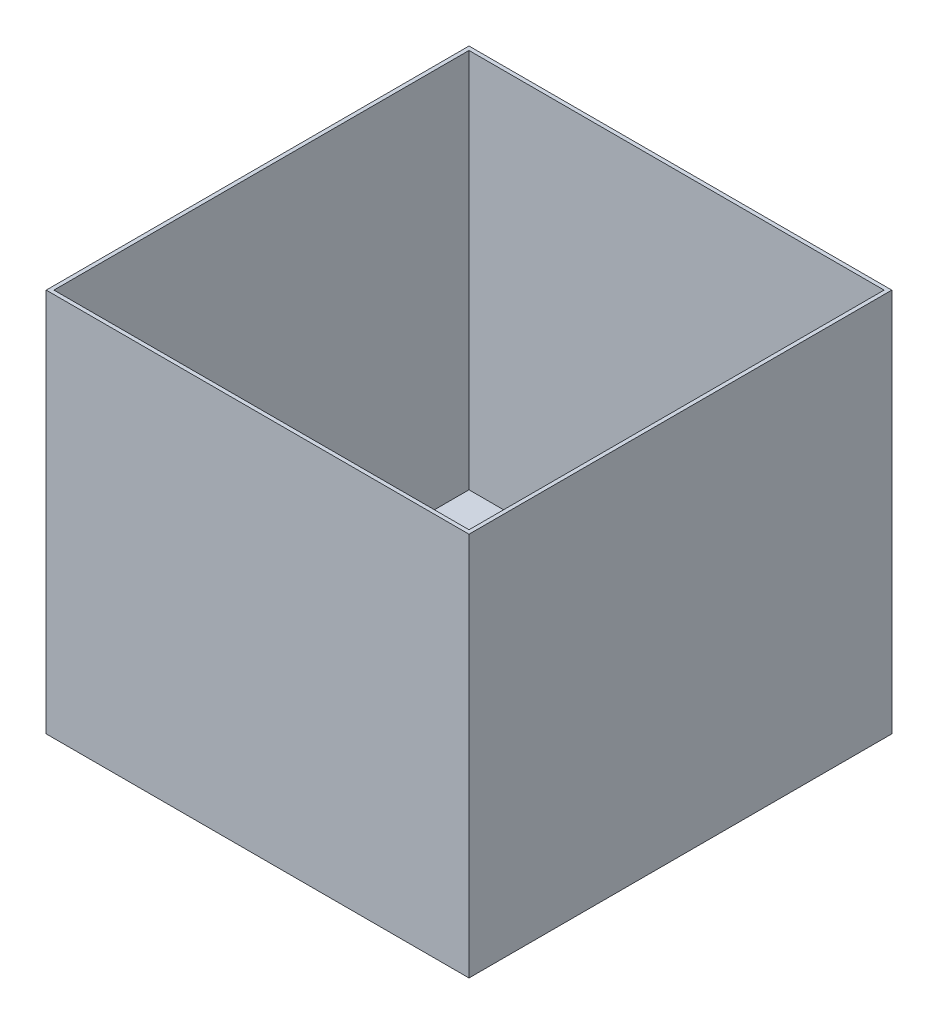
ISO-10303-21;
HEADER;
FILE_DESCRIPTION(('STEP AP214'),'2;1');
FILE_NAME('part.step','',(''),(''),'','','');
FILE_SCHEMA(('AUTOMOTIVE_DESIGN { 1 0 10303 214 1 1 1 1 }'));
ENDSEC;
DATA;
#1=APPLICATION_CONTEXT('core data for automotive mechanical design processes');
#2=APPLICATION_PROTOCOL_DEFINITION('international standard','automotive_design',2000,#1);
#3=PRODUCT_CONTEXT('',#1,'mechanical');
#4=PRODUCT('Part','Part','',(#3));
#5=PRODUCT_RELATED_PRODUCT_CATEGORY('part','',(#4));
#6=PRODUCT_DEFINITION_FORMATION('','',#4);
#7=PRODUCT_DEFINITION_CONTEXT('part definition',#1,'design');
#8=PRODUCT_DEFINITION('design','',#6,#7);
#9=PRODUCT_DEFINITION_SHAPE('','',#8);
#10=(LENGTH_UNIT() NAMED_UNIT(*) SI_UNIT(.MILLI.,.METRE.));
#11=(NAMED_UNIT(*) PLANE_ANGLE_UNIT() SI_UNIT($,.RADIAN.));
#12=(NAMED_UNIT(*) SI_UNIT($,.STERADIAN.) SOLID_ANGLE_UNIT());
#13=UNCERTAINTY_MEASURE_WITH_UNIT(LENGTH_MEASURE(1.E-05),#10,'distance_accuracy_value','');
#14=(GEOMETRIC_REPRESENTATION_CONTEXT(3) GLOBAL_UNCERTAINTY_ASSIGNED_CONTEXT((#13)) GLOBAL_UNIT_ASSIGNED_CONTEXT((#10,
#11,#12)) REPRESENTATION_CONTEXT('',''));
#15=CARTESIAN_POINT('',(0.,0.,0.));
#16=DIRECTION('',(0.,0.,1.));
#17=DIRECTION('',(1.,0.,0.));
#18=AXIS2_PLACEMENT_3D('',#15,#16,#17);
#19=CARTESIAN_POINT('',(0.,1000.,0.));
#20=DIRECTION('',(0.,-1.,0.));
#21=DIRECTION('',(0.,0.,-1.));
#22=AXIS2_PLACEMENT_3D('',#19,#20,#21);
#23=PLANE('',#22);
#24=DIRECTION('',(0.,0.,-1.));
#25=VECTOR('',#24,1.);
#26=CARTESIAN_POINT('',(550.,1000.,550.));
#27=LINE('',#26,#25);
#28=CARTESIAN_POINT('',(550.,1000.,550.));
#29=VERTEX_POINT('',#28);
#30=CARTESIAN_POINT('',(550.,1000.,-550.));
#31=VERTEX_POINT('',#30);
#32=EDGE_CURVE('E125',#29,#31,#27,.T.);
#33=ORIENTED_EDGE('',*,*,#32,.T.);
#34=DIRECTION('',(-1.,0.,0.));
#35=VECTOR('',#34,1.);
#36=CARTESIAN_POINT('',(-550.,1000.,-550.));
#37=LINE('',#36,#35);
#38=CARTESIAN_POINT('',(-550.,1000.,-550.));
#39=VERTEX_POINT('',#38);
#40=EDGE_CURVE('E69',#31,#39,#37,.T.);
#41=ORIENTED_EDGE('',*,*,#40,.T.);
#42=DIRECTION('',(0.,0.,1.));
#43=VECTOR('',#42,1.);
#44=CARTESIAN_POINT('',(-550.,1000.,550.));
#45=LINE('',#44,#43);
#46=CARTESIAN_POINT('',(-550.,1000.,550.));
#47=VERTEX_POINT('',#46);
#48=EDGE_CURVE('E128',#39,#47,#45,.T.);
#49=ORIENTED_EDGE('',*,*,#48,.T.);
#50=DIRECTION('',(1.,0.,0.));
#51=VECTOR('',#50,1.);
#52=CARTESIAN_POINT('',(-550.,1000.,550.));
#53=LINE('',#52,#51);
#54=EDGE_CURVE('E41',#47,#29,#53,.T.);
#55=ORIENTED_EDGE('',*,*,#54,.T.);
#56=EDGE_LOOP('',(#33,#41,#49,#55));
#57=FACE_BOUND('',#56,.T.);
#58=DIRECTION('',(0.,0.,-1.));
#59=VECTOR('',#58,1.);
#60=CARTESIAN_POINT('',(540.,1000.,0.));
#61=LINE('',#60,#59);
#62=CARTESIAN_POINT('',(540.,1000.,540.));
#63=VERTEX_POINT('',#62);
#64=CARTESIAN_POINT('',(540.,1000.,-540.));
#65=VERTEX_POINT('',#64);
#66=EDGE_CURVE('E114',#63,#65,#61,.T.);
#67=ORIENTED_EDGE('',*,*,#66,.F.);
#68=DIRECTION('',(1.,0.,0.));
#69=VECTOR('',#68,1.);
#70=CARTESIAN_POINT('',(0.,1000.,540.));
#71=LINE('',#70,#69);
#72=CARTESIAN_POINT('',(-540.,1000.,540.));
#73=VERTEX_POINT('',#72);
#74=EDGE_CURVE('E123',#73,#63,#71,.T.);
#75=ORIENTED_EDGE('',*,*,#74,.F.);
#76=DIRECTION('',(0.,0.,1.));
#77=VECTOR('',#76,1.);
#78=CARTESIAN_POINT('',(-540.,1000.,0.));
#79=LINE('',#78,#77);
#80=CARTESIAN_POINT('',(-540.,1000.,-540.));
#81=VERTEX_POINT('',#80);
#82=EDGE_CURVE('E121',#81,#73,#79,.T.);
#83=ORIENTED_EDGE('',*,*,#82,.F.);
#84=DIRECTION('',(-1.,0.,0.));
#85=VECTOR('',#84,1.);
#86=CARTESIAN_POINT('',(0.,1000.,-540.));
#87=LINE('',#86,#85);
#88=EDGE_CURVE('E106',#65,#81,#87,.T.);
#89=ORIENTED_EDGE('',*,*,#88,.F.);
#90=EDGE_LOOP('',(#67,#75,#83,#89));
#91=FACE_BOUND('',#90,.T.);
#92=ADVANCED_FACE('F17',(#57,#91),#23,.F.);
#93=CARTESIAN_POINT('',(550.,1000.,550.));
#94=DIRECTION('',(-1.,0.,0.));
#95=DIRECTION('',(0.,0.,1.));
#96=AXIS2_PLACEMENT_3D('',#93,#94,#95);
#97=PLANE('',#96);
#98=DIRECTION('',(0.,0.,-1.));
#99=VECTOR('',#98,1.);
#100=CARTESIAN_POINT('',(550.,0.,550.));
#101=LINE('',#100,#99);
#102=CARTESIAN_POINT('',(550.,0.,550.));
#103=VERTEX_POINT('',#102);
#104=CARTESIAN_POINT('',(550.,0.,-550.));
#105=VERTEX_POINT('',#104);
#106=EDGE_CURVE('E132',#103,#105,#101,.T.);
#107=ORIENTED_EDGE('',*,*,#106,.T.);
#108=DIRECTION('',(0.,-1.,0.));
#109=VECTOR('',#108,1.);
#110=CARTESIAN_POINT('',(550.,1000.,-550.));
#111=LINE('',#110,#109);
#112=EDGE_CURVE('E11',#31,#105,#111,.T.);
#113=ORIENTED_EDGE('',*,*,#112,.F.);
#114=ORIENTED_EDGE('',*,*,#32,.F.);
#115=DIRECTION('',(0.,-1.,0.));
#116=VECTOR('',#115,1.);
#117=CARTESIAN_POINT('',(550.,1000.,550.));
#118=LINE('',#117,#116);
#119=EDGE_CURVE('E131',#29,#103,#118,.T.);
#120=ORIENTED_EDGE('',*,*,#119,.T.);
#121=EDGE_LOOP('',(#107,#113,#114,#120));
#122=FACE_BOUND('',#121,.T.);
#123=ADVANCED_FACE('F19',(#122),#97,.F.);
#124=CARTESIAN_POINT('',(-550.,1000.,-550.));
#125=DIRECTION('',(0.,0.,1.));
#126=DIRECTION('',(1.,0.,0.));
#127=AXIS2_PLACEMENT_3D('',#124,#125,#126);
#128=PLANE('',#127);
#129=DIRECTION('',(-1.,0.,0.));
#130=VECTOR('',#129,1.);
#131=CARTESIAN_POINT('',(-550.,0.,-550.));
#132=LINE('',#131,#130);
#133=CARTESIAN_POINT('',(-550.,0.,-550.));
#134=VERTEX_POINT('',#133);
#135=EDGE_CURVE('E135',#105,#134,#132,.T.);
#136=ORIENTED_EDGE('',*,*,#135,.T.);
#137=DIRECTION('',(0.,-1.,0.));
#138=VECTOR('',#137,1.);
#139=CARTESIAN_POINT('',(-550.,1000.,-550.));
#140=LINE('',#139,#138);
#141=EDGE_CURVE('E25',#39,#134,#140,.T.);
#142=ORIENTED_EDGE('',*,*,#141,.F.);
#143=ORIENTED_EDGE('',*,*,#40,.F.);
#144=ORIENTED_EDGE('',*,*,#112,.T.);
#145=EDGE_LOOP('',(#136,#142,#143,#144));
#146=FACE_BOUND('',#145,.T.);
#147=ADVANCED_FACE('F165',(#146),#128,.F.);
#148=CARTESIAN_POINT('',(-550.,1000.,550.));
#149=DIRECTION('',(1.,0.,0.));
#150=DIRECTION('',(0.,0.,-1.));
#151=AXIS2_PLACEMENT_3D('',#148,#149,#150);
#152=PLANE('',#151);
#153=DIRECTION('',(0.,0.,1.));
#154=VECTOR('',#153,1.);
#155=CARTESIAN_POINT('',(-550.,0.,550.));
#156=LINE('',#155,#154);
#157=CARTESIAN_POINT('',(-550.,0.,550.));
#158=VERTEX_POINT('',#157);
#159=EDGE_CURVE('E137',#134,#158,#156,.T.);
#160=ORIENTED_EDGE('',*,*,#159,.T.);
#161=DIRECTION('',(0.,-1.,0.));
#162=VECTOR('',#161,1.);
#163=CARTESIAN_POINT('',(-550.,1000.,550.));
#164=LINE('',#163,#162);
#165=EDGE_CURVE('E141',#47,#158,#164,.T.);
#166=ORIENTED_EDGE('',*,*,#165,.F.);
#167=ORIENTED_EDGE('',*,*,#48,.F.);
#168=ORIENTED_EDGE('',*,*,#141,.T.);
#169=EDGE_LOOP('',(#160,#166,#167,#168));
#170=FACE_BOUND('',#169,.T.);
#171=ADVANCED_FACE('F146',(#170),#152,.F.);
#172=CARTESIAN_POINT('',(-550.,1000.,550.));
#173=DIRECTION('',(0.,0.,-1.));
#174=DIRECTION('',(-1.,0.,0.));
#175=AXIS2_PLACEMENT_3D('',#172,#173,#174);
#176=PLANE('',#175);
#177=DIRECTION('',(1.,0.,0.));
#178=VECTOR('',#177,1.);
#179=CARTESIAN_POINT('',(-550.,0.,550.));
#180=LINE('',#179,#178);
#181=EDGE_CURVE('E62',#158,#103,#180,.T.);
#182=ORIENTED_EDGE('',*,*,#181,.T.);
#183=ORIENTED_EDGE('',*,*,#119,.F.);
#184=ORIENTED_EDGE('',*,*,#54,.F.);
#185=ORIENTED_EDGE('',*,*,#165,.T.);
#186=EDGE_LOOP('',(#182,#183,#184,#185));
#187=FACE_BOUND('',#186,.T.);
#188=ADVANCED_FACE('F154',(#187),#176,.F.);
#189=CARTESIAN_POINT('',(0.,0.,0.));
#190=DIRECTION('',(0.,-1.,0.));
#191=DIRECTION('',(0.,0.,-1.));
#192=AXIS2_PLACEMENT_3D('',#189,#190,#191);
#193=PLANE('',#192);
#194=ORIENTED_EDGE('',*,*,#106,.F.);
#195=ORIENTED_EDGE('',*,*,#181,.F.);
#196=ORIENTED_EDGE('',*,*,#159,.F.);
#197=ORIENTED_EDGE('',*,*,#135,.F.);
#198=EDGE_LOOP('',(#194,#195,#196,#197));
#199=FACE_BOUND('',#198,.T.);
#200=ADVANCED_FACE('F150',(#199),#193,.T.);
#201=CARTESIAN_POINT('',(540.,1000.,550.));
#202=DIRECTION('',(-1.,0.,0.));
#203=DIRECTION('',(0.,0.,1.));
#204=AXIS2_PLACEMENT_3D('',#201,#202,#203);
#205=PLANE('',#204);
#206=DIRECTION('',(0.,0.,-1.));
#207=VECTOR('',#206,1.);
#208=CARTESIAN_POINT('',(540.,10.,0.));
#209=LINE('',#208,#207);
#210=CARTESIAN_POINT('',(540.,10.,540.));
#211=VERTEX_POINT('',#210);
#212=CARTESIAN_POINT('',(540.,10.,-540.));
#213=VERTEX_POINT('',#212);
#214=EDGE_CURVE('E97',#211,#213,#209,.T.);
#215=ORIENTED_EDGE('',*,*,#214,.F.);
#216=DIRECTION('',(0.,-1.,0.));
#217=VECTOR('',#216,1.);
#218=CARTESIAN_POINT('',(540.,1000.,540.));
#219=LINE('',#218,#217);
#220=EDGE_CURVE('E117',#63,#211,#219,.T.);
#221=ORIENTED_EDGE('',*,*,#220,.F.);
#222=ORIENTED_EDGE('',*,*,#66,.T.);
#223=DIRECTION('',(0.,-1.,0.));
#224=VECTOR('',#223,1.);
#225=CARTESIAN_POINT('',(540.,1000.,-540.));
#226=LINE('',#225,#224);
#227=EDGE_CURVE('E109',#65,#213,#226,.T.);
#228=ORIENTED_EDGE('',*,*,#227,.T.);
#229=EDGE_LOOP('',(#215,#221,#222,#228));
#230=FACE_BOUND('',#229,.T.);
#231=ADVANCED_FACE('F163',(#230),#205,.T.);
#232=CARTESIAN_POINT('',(-550.,1000.,-540.));
#233=DIRECTION('',(0.,0.,1.));
#234=DIRECTION('',(1.,0.,0.));
#235=AXIS2_PLACEMENT_3D('',#232,#233,#234);
#236=PLANE('',#235);
#237=DIRECTION('',(-1.,0.,0.));
#238=VECTOR('',#237,1.);
#239=CARTESIAN_POINT('',(0.,10.,-540.));
#240=LINE('',#239,#238);
#241=CARTESIAN_POINT('',(-540.,10.,-540.));
#242=VERTEX_POINT('',#241);
#243=EDGE_CURVE('E91',#213,#242,#240,.T.);
#244=ORIENTED_EDGE('',*,*,#243,.F.);
#245=ORIENTED_EDGE('',*,*,#227,.F.);
#246=ORIENTED_EDGE('',*,*,#88,.T.);
#247=DIRECTION('',(0.,-1.,0.));
#248=VECTOR('',#247,1.);
#249=CARTESIAN_POINT('',(-540.,1000.,-540.));
#250=LINE('',#249,#248);
#251=EDGE_CURVE('E103',#81,#242,#250,.T.);
#252=ORIENTED_EDGE('',*,*,#251,.T.);
#253=EDGE_LOOP('',(#244,#245,#246,#252));
#254=FACE_BOUND('',#253,.T.);
#255=ADVANCED_FACE('F104',(#254),#236,.T.);
#256=CARTESIAN_POINT('',(-540.,1000.,550.));
#257=DIRECTION('',(1.,0.,0.));
#258=DIRECTION('',(0.,0.,-1.));
#259=AXIS2_PLACEMENT_3D('',#256,#257,#258);
#260=PLANE('',#259);
#261=DIRECTION('',(0.,0.,1.));
#262=VECTOR('',#261,1.);
#263=CARTESIAN_POINT('',(-540.,10.,0.));
#264=LINE('',#263,#262);
#265=CARTESIAN_POINT('',(-540.,10.,540.));
#266=VERTEX_POINT('',#265);
#267=EDGE_CURVE('E95',#242,#266,#264,.T.);
#268=ORIENTED_EDGE('',*,*,#267,.F.);
#269=ORIENTED_EDGE('',*,*,#251,.F.);
#270=ORIENTED_EDGE('',*,*,#82,.T.);
#271=DIRECTION('',(0.,-1.,0.));
#272=VECTOR('',#271,1.);
#273=CARTESIAN_POINT('',(-540.,1000.,540.));
#274=LINE('',#273,#272);
#275=EDGE_CURVE('E32',#73,#266,#274,.T.);
#276=ORIENTED_EDGE('',*,*,#275,.T.);
#277=EDGE_LOOP('',(#268,#269,#270,#276));
#278=FACE_BOUND('',#277,.T.);
#279=ADVANCED_FACE('F111',(#278),#260,.T.);
#280=CARTESIAN_POINT('',(-550.,1000.,540.));
#281=DIRECTION('',(0.,0.,-1.));
#282=DIRECTION('',(-1.,0.,0.));
#283=AXIS2_PLACEMENT_3D('',#280,#281,#282);
#284=PLANE('',#283);
#285=DIRECTION('',(1.,0.,0.));
#286=VECTOR('',#285,1.);
#287=CARTESIAN_POINT('',(0.,10.,540.));
#288=LINE('',#287,#286);
#289=EDGE_CURVE('E112',#266,#211,#288,.T.);
#290=ORIENTED_EDGE('',*,*,#289,.F.);
#291=ORIENTED_EDGE('',*,*,#275,.F.);
#292=ORIENTED_EDGE('',*,*,#74,.T.);
#293=ORIENTED_EDGE('',*,*,#220,.T.);
#294=EDGE_LOOP('',(#290,#291,#292,#293));
#295=FACE_BOUND('',#294,.T.);
#296=ADVANCED_FACE('F177',(#295),#284,.T.);
#297=CARTESIAN_POINT('',(0.,10.,0.));
#298=DIRECTION('',(0.,-1.,0.));
#299=DIRECTION('',(0.,0.,-1.));
#300=AXIS2_PLACEMENT_3D('',#297,#298,#299);
#301=PLANE('',#300);
#302=ORIENTED_EDGE('',*,*,#214,.T.);
#303=ORIENTED_EDGE('',*,*,#243,.T.);
#304=ORIENTED_EDGE('',*,*,#267,.T.);
#305=ORIENTED_EDGE('',*,*,#289,.T.);
#306=EDGE_LOOP('',(#302,#303,#304,#305));
#307=FACE_BOUND('',#306,.T.);
#308=ADVANCED_FACE('F93',(#307),#301,.F.);
#309=CLOSED_SHELL('',(#92,#123,#147,#171,#188,#200,#231,#255,#279,#296,#308));
#310=MANIFOLD_SOLID_BREP('B1',#309);
#311=ADVANCED_BREP_SHAPE_REPRESENTATION('',(#18,#310),#14);
#312=SHAPE_DEFINITION_REPRESENTATION(#9,#311);
ENDSEC;
END-ISO-10303-21;
